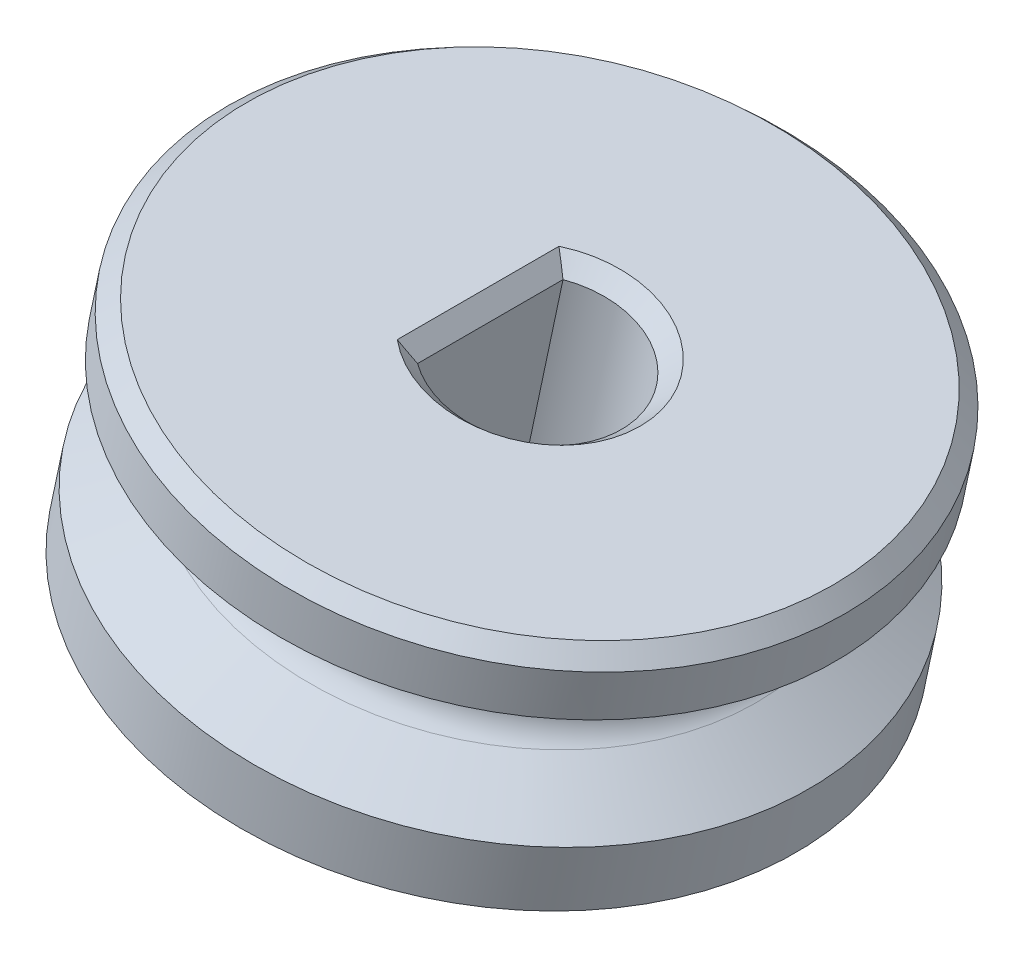
ISO-10303-21;
HEADER;
FILE_DESCRIPTION(('STEP AP214'),'2;1');
FILE_NAME('part.step','',(''),(''),'','','');
FILE_SCHEMA(('AUTOMOTIVE_DESIGN { 1 0 10303 214 1 1 1 1 }'));
ENDSEC;
DATA;
#1=APPLICATION_CONTEXT('core data for automotive mechanical design processes');
#2=APPLICATION_PROTOCOL_DEFINITION('international standard','automotive_design',2000,#1);
#3=PRODUCT_CONTEXT('',#1,'mechanical');
#4=PRODUCT('Part','Part','',(#3));
#5=PRODUCT_RELATED_PRODUCT_CATEGORY('part','',(#4));
#6=PRODUCT_DEFINITION_FORMATION('','',#4);
#7=PRODUCT_DEFINITION_CONTEXT('part definition',#1,'design');
#8=PRODUCT_DEFINITION('design','',#6,#7);
#9=PRODUCT_DEFINITION_SHAPE('','',#8);
#10=(LENGTH_UNIT() NAMED_UNIT(*) SI_UNIT(.MILLI.,.METRE.));
#11=(NAMED_UNIT(*) PLANE_ANGLE_UNIT() SI_UNIT($,.RADIAN.));
#12=(NAMED_UNIT(*) SI_UNIT($,.STERADIAN.) SOLID_ANGLE_UNIT());
#13=UNCERTAINTY_MEASURE_WITH_UNIT(LENGTH_MEASURE(1.E-05),#10,'distance_accuracy_value','');
#14=(GEOMETRIC_REPRESENTATION_CONTEXT(3) GLOBAL_UNCERTAINTY_ASSIGNED_CONTEXT((#13)) GLOBAL_UNIT_ASSIGNED_CONTEXT((#10,
#11,#12)) REPRESENTATION_CONTEXT('',''));
#15=CARTESIAN_POINT('',(0.,0.,0.));
#16=DIRECTION('',(0.,0.,1.));
#17=DIRECTION('',(1.,0.,0.));
#18=AXIS2_PLACEMENT_3D('',#15,#16,#17);
#19=CARTESIAN_POINT('',(-16.8643071290091,5.01311710508479,0.));
#20=DIRECTION('',(-0.207911690817802,-0.978147600733796,0.));
#21=DIRECTION('',(0.978147600733797,-0.207911690817802,0.));
#22=AXIS2_PLACEMENT_3D('',#19,#20,#21);
#23=PLANE('',#22);
#24=CARTESIAN_POINT('',(-16.8643071290091,5.01311710508479,0.));
#25=DIRECTION('',(-0.207911690817802,-0.978147600733796,0.));
#26=DIRECTION('',(0.978147600733797,-0.207911690817802,0.));
#27=AXIS2_PLACEMENT_3D('',#24,#25,#26);
#28=CIRCLE('',#27,3.8000000000001);
#29=CARTESIAN_POINT('',(-13.1473462462205,4.22305267997712,0.));
#30=VERTEX_POINT('',#29);
#31=EDGE_CURVE('E115',#30,#30,#28,.F.);
#32=ORIENTED_EDGE('',*,*,#31,.T.);
#33=EDGE_LOOP('',(#32));
#34=FACE_BOUND('',#33,.T.);
#35=CARTESIAN_POINT('',(-16.864307129009,5.01311710508477,0.));
#36=DIRECTION('',(-0.207911690817802,-0.978147600733796,0.));
#37=DIRECTION('',(0.978147600733797,-0.207911690817802,0.));
#38=AXIS2_PLACEMENT_3D('',#35,#36,#37);
#39=CIRCLE('',#38,1.30000000000077);
#40=CARTESIAN_POINT('',(-17.6468252095967,5.17944645773917,-1.02469507659637));
#41=VERTEX_POINT('',#40);
#42=CARTESIAN_POINT('',(-17.6468252095967,5.17944645773917,1.02469507659637));
#43=VERTEX_POINT('',#42);
#44=EDGE_CURVE('E101',#41,#43,#39,.T.);
#45=ORIENTED_EDGE('',*,*,#44,.T.);
#46=DIRECTION('',(0.,0.,-1.));
#47=VECTOR('',#46,1.);
#48=CARTESIAN_POINT('',(-17.6468252095967,5.17944645773917,0.));
#49=LINE('',#48,#47);
#50=EDGE_CURVE('E103',#43,#41,#49,.T.);
#51=ORIENTED_EDGE('',*,*,#50,.T.);
#52=EDGE_LOOP('',(#45,#51));
#53=FACE_BOUND('',#52,.T.);
#54=ADVANCED_FACE('F43',(#34,#53),#23,.F.);
#55=CARTESIAN_POINT('',(-17.9298780641152,2.25514051876985E-13,0.));
#56=DIRECTION('',(0.207911690817802,0.978147600733796,0.));
#57=DIRECTION('',(-0.978147600733797,0.207911690817802,0.));
#58=AXIS2_PLACEMENT_3D('',#55,#56,#57);
#59=CONICAL_SURFACE('',#58,0.,1.36135681655563);
#60=CARTESIAN_POINT('',(-17.8414920758528,0.415823381635657,0.));
#61=DIRECTION('',(0.207911690817802,0.978147600733796,0.));
#62=DIRECTION('',(-0.978147600733797,0.207911690817802,0.));
#63=AXIS2_PLACEMENT_3D('',#60,#61,#62);
#64=CIRCLE('',#63,2.00000000000008);
#65=CARTESIAN_POINT('',(-19.7977872773204,0.831646763271261,0.));
#66=VERTEX_POINT('',#65);
#67=EDGE_CURVE('E96',#66,#66,#64,.T.);
#68=ORIENTED_EDGE('',*,*,#67,.F.);
#69=EDGE_LOOP('',(#68));
#70=FACE_BOUND('',#69,.T.);
#71=CARTESIAN_POINT('',(-17.8812657705709,0.228702859899703,0.));
#72=DIRECTION('',(0.207911690817802,0.978147600733796,0.));
#73=DIRECTION('',(-0.978147600733797,0.207911690817802,0.));
#74=AXIS2_PLACEMENT_3D('',#71,#72,#73);
#75=CIRCLE('',#74,1.1);
#76=CARTESIAN_POINT('',(-18.4681543310109,0.353449874390292,-0.921954445729286));
#77=VERTEX_POINT('',#76);
#78=CARTESIAN_POINT('',(-18.4681543310109,0.353449874390293,0.921954445729286));
#79=VERTEX_POINT('',#78);
#80=EDGE_CURVE('E95',#77,#79,#75,.F.);
#81=ORIENTED_EDGE('',*,*,#80,.F.);
#82=CARTESIAN_POINT('',(-18.4681469227851,0.353484727352571,-0.922154445729286));
#83=CARTESIAN_POINT('',(-18.4698535218197,0.345455810149333,-0.87601502711287));
#84=CARTESIAN_POINT('',(-18.4715278506274,0.337578712427678,-0.829845905135946));
#85=CARTESIAN_POINT('',(-18.4747726223408,0.322313261726397,-0.737413271401055));
#86=CARTESIAN_POINT('',(-18.4763430424821,0.314925015845074,-0.691149741233467));
#87=CARTESIAN_POINT('',(-18.4793464695634,0.300795002366643,-0.598309478263664));
#88=CARTESIAN_POINT('',(-18.4807788409653,0.294056224741509,-0.551732263353229));
#89=CARTESIAN_POINT('',(-18.4834341720825,0.281563874016567,-0.458437256586886));
#90=CARTESIAN_POINT('',(-18.4846571314329,0.275810302634103,-0.411719464486078));
#91=CARTESIAN_POINT('',(-18.4867898869175,0.265776476965258,-0.318836683326539));
#92=CARTESIAN_POINT('',(-18.4877041826706,0.261475053636027,-0.27267415509489));
#93=CARTESIAN_POINT('',(-18.4891464042402,0.254689934615401,-0.180211057618883));
#94=CARTESIAN_POINT('',(-18.4896743931473,0.252205942105408,-0.133910512155927));
#95=CARTESIAN_POINT('',(-18.4902647441992,0.249428558771681,-0.0413347996844621));
#96=CARTESIAN_POINT('',(-18.490328087826,0.249130550437767,0.00494021423847374));
#97=CARTESIAN_POINT('',(-18.4899808761605,0.250764052893493,0.0974492092381901));
#98=CARTESIAN_POINT('',(-18.4895702922584,0.252695698281954,0.143683187669132));
#99=CARTESIAN_POINT('',(-18.4881403199663,0.25942318898297,0.250996866409799));
#100=CARTESIAN_POINT('',(-18.4869666446876,0.264944897038106,0.312027128923356));
#101=CARTESIAN_POINT('',(-18.4841247186317,0.278315107929355,0.433887781577674));
#102=CARTESIAN_POINT('',(-18.4824558026557,0.286166740280105,0.494717790914628));
#103=CARTESIAN_POINT('',(-18.4787911804139,0.303407432419138,0.616812318798005));
#104=CARTESIAN_POINT('',(-18.476792149678,0.312812132608721,0.678074465611502));
#105=CARTESIAN_POINT('',(-18.47259355874,0.332564949953103,0.800292231711232));
#106=CARTESIAN_POINT('',(-18.4703944837639,0.342910784298898,0.861248233265501));
#107=CARTESIAN_POINT('',(-18.4681469227851,0.353484727352571,0.922154445729286));
#108=B_SPLINE_CURVE_WITH_KNOTS('',3,(#82,#83,#84,#85,#86,#87,#88,#89,#90,#91,#92,#93,#94,#95,
#96,#97,#98,#99,#100,#101,#102,#103,#104,#105,#106,#107),.UNSPECIFIED.,.F.,.F.,(4,2,2,2,2,2,2,2,
2,2,2,2,4),(0.,0.140594462143718,0.281219624611676,0.422464018274744,0.563708658142811,
0.702795069869943,0.841858761252327,0.980628620031653,1.11940685645099,1.30320420875395,
1.48724956067832,1.67327614509564,1.85886296018762),.UNSPECIFIED.);
#109=EDGE_CURVE('E86',#77,#79,#108,.T.);
#110=ORIENTED_EDGE('',*,*,#109,.T.);
#111=EDGE_LOOP('',(#81,#110));
#112=FACE_BOUND('',#111,.T.);
#113=ADVANCED_FACE('F100',(#70,#112),#59,.T.);
#114=CARTESIAN_POINT('',(-16.8643071290091,5.0131171050847,0.));
#115=DIRECTION('',(0.207911690817802,0.978147600733796,0.));
#116=DIRECTION('',(-0.978147600733797,0.207911690817802,0.));
#117=AXIS2_PLACEMENT_3D('',#114,#115,#116);
#118=CYLINDRICAL_SURFACE('',#117,2.);
#119=CARTESIAN_POINT('',(-17.7375362304439,0.904897182002648,0.));
#120=DIRECTION('',(0.207911690817802,0.978147600733796,0.));
#121=DIRECTION('',(-0.978147600733797,0.207911690817802,0.));
#122=AXIS2_PLACEMENT_3D('',#119,#120,#121);
#123=CIRCLE('',#122,1.99999999999991);
#124=CARTESIAN_POINT('',(-19.6938314319115,1.32072056363825,0.));
#125=VERTEX_POINT('',#124);
#126=EDGE_CURVE('E294',#125,#125,#123,.T.);
#127=CARTESIAN_POINT('',(-19.6938314319115,1.32072056363825,0.));
#128=CARTESIAN_POINT('',(-19.6949143053011,1.31562604488443,0.));
#129=CARTESIAN_POINT('',(-19.6959971786908,1.31053152613061,0.));
#130=CARTESIAN_POINT('',(-19.6981629254702,1.30034248862296,0.));
#131=CARTESIAN_POINT('',(-19.6992457988598,1.29524796986914,0.));
#132=CARTESIAN_POINT('',(-19.7014115456392,1.28505893236149,0.));
#133=CARTESIAN_POINT('',(-19.7024944190289,1.27996441360767,0.));
#134=CARTESIAN_POINT('',(-19.7046601658082,1.26977537610002,0.));
#135=CARTESIAN_POINT('',(-19.7057430391979,1.2646808573462,0.));
#136=CARTESIAN_POINT('',(-19.7079087859772,1.25449181983856,0.));
#137=CARTESIAN_POINT('',(-19.7089916593669,1.24939730108473,0.));
#138=CARTESIAN_POINT('',(-19.7111574061463,1.23920826357709,0.));
#139=CARTESIAN_POINT('',(-19.712240279536,1.23411374482326,0.));
#140=CARTESIAN_POINT('',(-19.7144060263153,1.22392470731562,0.));
#141=CARTESIAN_POINT('',(-19.715488899705,1.2188301885618,0.));
#142=CARTESIAN_POINT('',(-19.7176546464843,1.20864115105415,0.));
#143=CARTESIAN_POINT('',(-19.718737519874,1.20354663230033,0.));
#144=CARTESIAN_POINT('',(-19.7209032666534,1.19335759479268,0.));
#145=CARTESIAN_POINT('',(-19.721986140043,1.18826307603886,0.));
#146=CARTESIAN_POINT('',(-19.7241518868224,1.17807403853121,0.));
#147=CARTESIAN_POINT('',(-19.7252347602121,1.17297951977739,0.));
#148=CARTESIAN_POINT('',(-19.7274005069914,1.16279048226974,0.));
#149=CARTESIAN_POINT('',(-19.7284833803811,1.15769596351592,0.));
#150=CARTESIAN_POINT('',(-19.7306491271604,1.14750692600828,0.));
#151=CARTESIAN_POINT('',(-19.7317320005501,1.14241240725445,0.));
#152=CARTESIAN_POINT('',(-19.7338977473295,1.13222336974681,0.));
#153=CARTESIAN_POINT('',(-19.7349806207192,1.12712885099299,0.));
#154=CARTESIAN_POINT('',(-19.7371463674985,1.11693981348534,0.));
#155=CARTESIAN_POINT('',(-19.7382292408882,1.11184529473152,0.));
#156=CARTESIAN_POINT('',(-19.7403949876675,1.10165625722387,0.));
#157=CARTESIAN_POINT('',(-19.7414778610572,1.09656173847005,0.));
#158=CARTESIAN_POINT('',(-19.7436436078366,1.0863727009624,0.));
#159=CARTESIAN_POINT('',(-19.7447264812262,1.08127818220858,0.));
#160=CARTESIAN_POINT('',(-19.7468922280056,1.07108914470093,0.));
#161=CARTESIAN_POINT('',(-19.7479751013953,1.06599462594711,0.));
#162=CARTESIAN_POINT('',(-19.7501408481746,1.05580558843947,0.));
#163=CARTESIAN_POINT('',(-19.7512237215643,1.05071106968564,0.));
#164=CARTESIAN_POINT('',(-19.7533894683436,1.040522032178,0.));
#165=CARTESIAN_POINT('',(-19.7544723417333,1.03542751342417,0.));
#166=CARTESIAN_POINT('',(-19.7566380885127,1.02523847591653,0.));
#167=CARTESIAN_POINT('',(-19.7577209619024,1.02014395716271,0.));
#168=CARTESIAN_POINT('',(-19.7598867086817,1.00995491965506,0.));
#169=CARTESIAN_POINT('',(-19.7609695820714,1.00486040090124,0.));
#170=CARTESIAN_POINT('',(-19.7631353288507,0.994671363393592,0.));
#171=CARTESIAN_POINT('',(-19.7642182022404,0.989576844639769,0.));
#172=CARTESIAN_POINT('',(-19.7663839490198,0.979387807132123,0.));
#173=CARTESIAN_POINT('',(-19.7674668224094,0.9742932883783,0.));
#174=CARTESIAN_POINT('',(-19.7696325691888,0.964104250870654,0.));
#175=CARTESIAN_POINT('',(-19.7707154425785,0.959009732116832,0.));
#176=CARTESIAN_POINT('',(-19.7728811893578,0.948820694609186,0.));
#177=CARTESIAN_POINT('',(-19.7739640627475,0.943726175855364,0.));
#178=CARTESIAN_POINT('',(-19.7761298095268,0.933537138347718,0.));
#179=CARTESIAN_POINT('',(-19.7772126829165,0.928442619593895,0.));
#180=CARTESIAN_POINT('',(-19.7793784296959,0.91825358208625,0.));
#181=CARTESIAN_POINT('',(-19.7804613030856,0.913159063332427,0.));
#182=CARTESIAN_POINT('',(-19.7826270498649,0.902970025824782,0.));
#183=CARTESIAN_POINT('',(-19.7837099232546,0.897875507070959,0.));
#184=CARTESIAN_POINT('',(-19.7858756700339,0.887686469563313,0.));
#185=CARTESIAN_POINT('',(-19.7869585434236,0.88259195080949,0.));
#186=CARTESIAN_POINT('',(-19.789124290203,0.872402913301844,0.));
#187=CARTESIAN_POINT('',(-19.7902071635926,0.867308394548022,0.));
#188=CARTESIAN_POINT('',(-19.792372910372,0.857119357040376,0.));
#189=CARTESIAN_POINT('',(-19.7934557837617,0.852024838286553,0.));
#190=CARTESIAN_POINT('',(-19.795621530541,0.841835800778908,0.));
#191=CARTESIAN_POINT('',(-19.7967044039307,0.836741282025085,0.));
#192=CARTESIAN_POINT('',(-19.7977872773204,0.831646763271261,0.));
#193=B_SPLINE_CURVE_WITH_KNOTS('',3,(#127,#128,#129,#130,#131,#132,#133,#134,#135,#136,#137,
#138,#139,#140,#141,#142,#143,#144,#145,#146,#147,#148,#149,#150,#151,#152,#153,#154,#155,#156,
#157,#158,#159,#160,#161,#162,#163,#164,#165,#166,#167,#168,#169,#170,#171,#172,#173,#174,#175,
#176,#177,#178,#179,#180,#181,#182,#183,#184,#185,#186,#187,#188,#189,#190,#191,#192),
.UNSPECIFIED.,.F.,.F.,(4,2,2,2,2,2,2,2,2,2,2,2,2,2,2,2,2,2,2,2,2,2,2,2,2,2,2,2,2,2,2,2,4),(0.,
0.0156250000000039,0.031250000000007,0.0468750000000093,0.0625000000000124,0.0781250000000147,
0.0937500000000186,0.109375000000022,0.125000000000024,0.140625000000026,0.15625000000003,
0.171875000000033,0.187500000000036,0.203125000000039,0.218750000000042,0.234375000000045,
0.250000000000048,0.26562500000005,0.281250000000053,0.296875000000057,0.31250000000006,
0.328125000000063,0.343750000000065,0.359375000000069,0.375000000000071,0.390625000000074,
0.406250000000077,0.42187500000008,0.437500000000083,0.453125000000086,0.468750000000088,
0.484375000000092,0.500000000000095),.UNSPECIFIED.);
#194=EDGE_CURVE('BSEAM145',#125,#66,#193,.T.);
#195=ORIENTED_EDGE('',*,*,#126,.F.);
#196=ORIENTED_EDGE('',*,*,#67,.T.);
#197=ORIENTED_EDGE('',*,*,#194,.T.);
#198=ORIENTED_EDGE('',*,*,#194,.F.);
#199=EDGE_LOOP('',(#195,#197,#196,#198));
#200=FACE_BOUND('',#199,.T.);
#201=ADVANCED_FACE('F145',(#200),#118,.T.);
#202=CARTESIAN_POINT('',(-17.7375362304438,0.904897182002761,0.));
#203=DIRECTION('',(0.207911690817802,0.978147600733796,0.));
#204=DIRECTION('',(-0.978147600733797,0.207911690817802,0.));
#205=AXIS2_PLACEMENT_3D('',#202,#203,#204);
#206=TOROIDAL_SURFACE('',#205,3.00000000000002,1.00000000000011);
#207=CARTESIAN_POINT('',(-17.529624539626,1.88304478273667,0.));
#208=DIRECTION('',(0.207911690817802,0.978147600733796,0.));
#209=DIRECTION('',(-0.978147600733797,0.207911690817802,0.));
#210=AXIS2_PLACEMENT_3D('',#207,#208,#209);
#211=CIRCLE('',#210,2.99999999999997);
#212=CARTESIAN_POINT('',(-20.4640673418274,2.50677985519007,0.));
#213=VERTEX_POINT('',#212);
#214=EDGE_CURVE('E291',#213,#213,#211,.T.);
#215=ORIENTED_EDGE('',*,*,#214,.F.);
#216=EDGE_LOOP('',(#215));
#217=FACE_BOUND('',#216,.T.);
#218=ORIENTED_EDGE('',*,*,#126,.T.);
#219=EDGE_LOOP('',(#218));
#220=FACE_BOUND('',#219,.T.);
#221=ADVANCED_FACE('F149',(#217,#220),#206,.F.);
#222=CARTESIAN_POINT('',(-14.5951817374246,1.25930971028327,0.));
#223=DIRECTION('',(0.207911690817802,0.978147600733796,0.));
#224=DIRECTION('',(-0.978147600733797,0.207911690817802,0.));
#225=AXIS2_PLACEMENT_3D('',#222,#223,#224);
#226=PLANE('',#225);
#227=CARTESIAN_POINT('',(-17.529624539626,1.88304478273669,0.));
#228=DIRECTION('',(0.207911690817802,0.978147600733796,0.));
#229=DIRECTION('',(-0.978147600733797,0.207911690817802,0.));
#230=AXIS2_PLACEMENT_3D('',#227,#228,#229);
#231=CIRCLE('',#230,4.00000000000015);
#232=CARTESIAN_POINT('',(-21.4422149425613,2.71469154600792,0.));
#233=VERTEX_POINT('',#232);
#234=EDGE_CURVE('E288',#233,#233,#231,.T.);
#235=ORIENTED_EDGE('',*,*,#234,.F.);
#236=EDGE_LOOP('',(#235));
#237=FACE_BOUND('',#236,.T.);
#238=ORIENTED_EDGE('',*,*,#214,.T.);
#239=EDGE_LOOP('',(#238));
#240=FACE_BOUND('',#239,.T.);
#241=ADVANCED_FACE('F153',(#237,#240),#226,.F.);
#242=CARTESIAN_POINT('',(-16.8643071290091,5.0131171050847,0.));
#243=DIRECTION('',(0.207911690817802,0.978147600733796,0.));
#244=DIRECTION('',(-0.978147600733797,0.207911690817802,0.));
#245=AXIS2_PLACEMENT_3D('',#242,#243,#244);
#246=CYLINDRICAL_SURFACE('',#245,4.00000000000013);
#247=CARTESIAN_POINT('',(-17.3632951869718,2.66556286332372,0.));
#248=DIRECTION('',(0.207911690817802,0.978147600733796,0.));
#249=DIRECTION('',(-0.978147600733797,0.207911690817802,0.));
#250=AXIS2_PLACEMENT_3D('',#247,#248,#249);
#251=CIRCLE('',#250,4.00000000000011);
#252=CARTESIAN_POINT('',(-21.2758855899071,3.49720962659496,0.));
#253=VERTEX_POINT('',#252);
#254=EDGE_CURVE('E285',#253,#253,#251,.T.);
#255=CARTESIAN_POINT('',(-21.2758855899071,3.49720962659496,0.));
#256=CARTESIAN_POINT('',(-21.2776181873306,3.48905839658885,0.));
#257=CARTESIAN_POINT('',(-21.279350784754,3.48090716658273,0.));
#258=CARTESIAN_POINT('',(-21.282815979601,3.4646047065705,0.));
#259=CARTESIAN_POINT('',(-21.2845485770245,3.45645347656439,0.));
#260=CARTESIAN_POINT('',(-21.2880137718715,3.44015101655216,0.));
#261=CARTESIAN_POINT('',(-21.2897463692949,3.43199978654604,0.));
#262=CARTESIAN_POINT('',(-21.2932115641419,3.41569732653381,0.));
#263=CARTESIAN_POINT('',(-21.2949441615654,3.4075460965277,0.));
#264=CARTESIAN_POINT('',(-21.2984093564123,3.39124363651547,0.));
#265=CARTESIAN_POINT('',(-21.3001419538358,3.38309240650935,0.));
#266=CARTESIAN_POINT('',(-21.3036071486828,3.36678994649712,0.));
#267=CARTESIAN_POINT('',(-21.3053397461063,3.35863871649101,0.));
#268=CARTESIAN_POINT('',(-21.3088049409532,3.34233625647878,0.));
#269=CARTESIAN_POINT('',(-21.3105375383767,3.33418502647266,0.));
#270=CARTESIAN_POINT('',(-21.3140027332237,3.31788256646043,0.));
#271=CARTESIAN_POINT('',(-21.3157353306472,3.30973133645432,0.));
#272=CARTESIAN_POINT('',(-21.3192005254941,3.29342887644209,0.));
#273=CARTESIAN_POINT('',(-21.3209331229176,3.28527764643597,0.));
#274=CARTESIAN_POINT('',(-21.3243983177646,3.26897518642374,0.));
#275=CARTESIAN_POINT('',(-21.3261309151881,3.26082395641763,0.));
#276=CARTESIAN_POINT('',(-21.329596110035,3.2445214964054,0.));
#277=CARTESIAN_POINT('',(-21.3313287074585,3.23637026639928,0.));
#278=CARTESIAN_POINT('',(-21.3347939023055,3.22006780638705,0.));
#279=CARTESIAN_POINT('',(-21.3365264997289,3.21191657638094,0.));
#280=CARTESIAN_POINT('',(-21.3399916945759,3.19561411636871,0.));
#281=CARTESIAN_POINT('',(-21.3417242919994,3.18746288636259,0.));
#282=CARTESIAN_POINT('',(-21.3451894868464,3.17116042635036,0.));
#283=CARTESIAN_POINT('',(-21.3469220842698,3.16300919634425,0.));
#284=CARTESIAN_POINT('',(-21.3503872791168,3.14670673633202,0.));
#285=CARTESIAN_POINT('',(-21.3521198765403,3.1385555063259,0.));
#286=CARTESIAN_POINT('',(-21.3555850713872,3.12225304631367,0.));
#287=CARTESIAN_POINT('',(-21.3573176688107,3.11410181630756,0.));
#288=CARTESIAN_POINT('',(-21.3607828636577,3.09779935629533,0.));
#289=CARTESIAN_POINT('',(-21.3625154610812,3.08964812628921,0.));
#290=CARTESIAN_POINT('',(-21.3659806559281,3.07334566627698,0.));
#291=CARTESIAN_POINT('',(-21.3677132533516,3.06519443627087,0.));
#292=CARTESIAN_POINT('',(-21.3711784481986,3.04889197625864,0.));
#293=CARTESIAN_POINT('',(-21.3729110456221,3.04074074625252,0.));
#294=CARTESIAN_POINT('',(-21.376376240469,3.02443828624029,0.));
#295=CARTESIAN_POINT('',(-21.3781088378925,3.01628705623418,0.));
#296=CARTESIAN_POINT('',(-21.3815740327395,2.99998459622195,0.));
#297=CARTESIAN_POINT('',(-21.3833066301629,2.99183336621583,0.));
#298=CARTESIAN_POINT('',(-21.3867718250099,2.9755309062036,0.));
#299=CARTESIAN_POINT('',(-21.3885044224334,2.96737967619749,0.));
#300=CARTESIAN_POINT('',(-21.3919696172804,2.95107721618526,0.));
#301=CARTESIAN_POINT('',(-21.3937022147038,2.94292598617914,0.));
#302=CARTESIAN_POINT('',(-21.3971674095508,2.92662352616691,0.));
#303=CARTESIAN_POINT('',(-21.3989000069743,2.9184722961608,0.));
#304=CARTESIAN_POINT('',(-21.4023652018212,2.90216983614857,0.));
#305=CARTESIAN_POINT('',(-21.4040977992447,2.89401860614245,0.));
#306=CARTESIAN_POINT('',(-21.4075629940917,2.87771614613022,0.));
#307=CARTESIAN_POINT('',(-21.4092955915152,2.86956491612411,0.));
#308=CARTESIAN_POINT('',(-21.4127607863621,2.85326245611188,0.));
#309=CARTESIAN_POINT('',(-21.4144933837856,2.84511122610576,0.));
#310=CARTESIAN_POINT('',(-21.4179585786326,2.82880876609353,0.));
#311=CARTESIAN_POINT('',(-21.4196911760561,2.82065753608742,0.));
#312=CARTESIAN_POINT('',(-21.423156370903,2.80435507607519,0.));
#313=CARTESIAN_POINT('',(-21.4248889683265,2.79620384606907,0.));
#314=CARTESIAN_POINT('',(-21.4283541631735,2.77990138605684,0.));
#315=CARTESIAN_POINT('',(-21.430086760597,2.77175015605073,0.));
#316=CARTESIAN_POINT('',(-21.4335519554439,2.7554476960385,0.));
#317=CARTESIAN_POINT('',(-21.4352845528674,2.74729646603238,0.));
#318=CARTESIAN_POINT('',(-21.4387497477144,2.73099400602015,0.));
#319=CARTESIAN_POINT('',(-21.4404823451378,2.72284277601404,0.));
#320=CARTESIAN_POINT('',(-21.4422149425613,2.71469154600792,0.));
#321=B_SPLINE_CURVE_WITH_KNOTS('',3,(#255,#256,#257,#258,#259,#260,#261,#262,#263,#264,#265,
#266,#267,#268,#269,#270,#271,#272,#273,#274,#275,#276,#277,#278,#279,#280,#281,#282,#283,#284,
#285,#286,#287,#288,#289,#290,#291,#292,#293,#294,#295,#296,#297,#298,#299,#300,#301,#302,#303,
#304,#305,#306,#307,#308,#309,#310,#311,#312,#313,#314,#315,#316,#317,#318,#319,#320),
.UNSPECIFIED.,.F.,.F.,(4,2,2,2,2,2,2,2,2,2,2,2,2,2,2,2,2,2,2,2,2,2,2,2,2,2,2,2,2,2,2,2,4),(0.,
0.025,0.0500000000000004,0.0750000000000004,0.0999999999999997,0.125,0.15,0.175,0.2,0.225,0.25,
0.275,0.3,0.325000000000001,0.350000000000001,0.375000000000001,0.400000000000001,
0.425000000000001,0.450000000000001,0.475000000000001,0.500000000000001,0.525000000000001,
0.550000000000001,0.575000000000001,0.600000000000001,0.625000000000001,0.650000000000001,
0.675000000000001,0.700000000000001,0.725000000000001,0.750000000000001,0.775000000000001,
0.800000000000001),.UNSPECIFIED.);
#322=EDGE_CURVE('BSEAM157',#253,#233,#321,.T.);
#323=ORIENTED_EDGE('',*,*,#254,.F.);
#324=ORIENTED_EDGE('',*,*,#234,.T.);
#325=ORIENTED_EDGE('',*,*,#322,.T.);
#326=ORIENTED_EDGE('',*,*,#322,.F.);
#327=EDGE_LOOP('',(#323,#325,#324,#326));
#328=FACE_BOUND('',#327,.T.);
#329=ADVANCED_FACE('F157',(#328),#246,.T.);
#330=CARTESIAN_POINT('',(-17.3632951869718,2.66556286332372,0.));
#331=DIRECTION('',(-0.207911690817802,-0.978147600733796,0.));
#332=DIRECTION('',(0.978147600733797,-0.207911690817802,0.));
#333=AXIS2_PLACEMENT_3D('',#330,#331,#332);
#334=CONICAL_SURFACE('',#333,4.00000000000011,1.0471975511966);
#335=CARTESIAN_POINT('',(-17.2689885567143,3.10924067555626,0.));
#336=DIRECTION('',(0.207911690817802,0.978147600733796,0.));
#337=DIRECTION('',(-0.978147600733797,0.207911690817802,0.));
#338=AXIS2_PLACEMENT_3D('',#335,#336,#337);
#339=CIRCLE('',#338,3.21435935394499);
#340=CARTESIAN_POINT('',(-20.4131064466719,3.77754356373098,0.));
#341=VERTEX_POINT('',#340);
#342=EDGE_CURVE('E282',#341,#341,#339,.T.);
#343=ORIENTED_EDGE('',*,*,#342,.F.);
#344=EDGE_LOOP('',(#343));
#345=FACE_BOUND('',#344,.T.);
#346=ORIENTED_EDGE('',*,*,#254,.T.);
#347=EDGE_LOOP('',(#346));
#348=FACE_BOUND('',#347,.T.);
#349=ADVANCED_FACE('F161',(#345,#348),#334,.T.);
#350=CARTESIAN_POINT('',(-17.1969658343175,3.44808094391077,0.));
#351=DIRECTION('',(0.207911690817802,0.978147600733796,0.));
#352=DIRECTION('',(-0.978147600733797,0.207911690817802,0.));
#353=AXIS2_PLACEMENT_3D('',#350,#351,#352);
#354=TOROIDAL_SURFACE('',#353,3.41435935394498,0.4);
#355=CARTESIAN_POINT('',(-17.1249431119207,3.78692121226527,0.));
#356=DIRECTION('',(0.207911690817802,0.978147600733796,0.));
#357=DIRECTION('',(-0.978147600733797,0.207911690817802,0.));
#358=AXIS2_PLACEMENT_3D('',#355,#356,#357);
#359=CIRCLE('',#358,3.21435935394496);
#360=CARTESIAN_POINT('',(-20.2690610018782,4.45522410043999,0.));
#361=VERTEX_POINT('',#360);
#362=EDGE_CURVE('E277',#361,#361,#359,.T.);
#363=ORIENTED_EDGE('',*,*,#362,.F.);
#364=EDGE_LOOP('',(#363));
#365=FACE_BOUND('',#364,.T.);
#366=ORIENTED_EDGE('',*,*,#342,.T.);
#367=EDGE_LOOP('',(#366));
#368=FACE_BOUND('',#367,.T.);
#369=ADVANCED_FACE('F165',(#365,#368),#354,.F.);
#370=CARTESIAN_POINT('',(-17.1249431119207,3.78692121226527,0.));
#371=DIRECTION('',(0.207911690817802,0.978147600733796,0.));
#372=DIRECTION('',(-0.978147600733797,0.207911690817802,0.));
#373=AXIS2_PLACEMENT_3D('',#370,#371,#372);
#374=CONICAL_SURFACE('',#373,3.21435935394496,1.04719755119655);
#375=CARTESIAN_POINT('',(-17.0306364816633,4.23059902449784,0.));
#376=DIRECTION('',(0.207911690817802,0.978147600733796,0.));
#377=DIRECTION('',(-0.978147600733797,0.207911690817802,0.));
#378=AXIS2_PLACEMENT_3D('',#375,#376,#377);
#379=CIRCLE('',#378,4.00000000000004);
#380=CARTESIAN_POINT('',(-20.9432268845985,5.06224578776905,0.));
#381=VERTEX_POINT('',#380);
#382=EDGE_CURVE('E274',#381,#381,#379,.T.);
#383=CARTESIAN_POINT('',(-20.9432268845985,5.06224578776905,0.));
#384=CARTESIAN_POINT('',(-20.9362043233202,5.05592264519271,0.));
#385=CARTESIAN_POINT('',(-20.9291817620418,5.04959950261636,0.));
#386=CARTESIAN_POINT('',(-20.9151366394852,5.03695321746368,0.));
#387=CARTESIAN_POINT('',(-20.9081140782068,5.03063007488733,0.));
#388=CARTESIAN_POINT('',(-20.8940689556501,5.01798378973464,0.));
#389=CARTESIAN_POINT('',(-20.8870463943718,5.0116606471583,0.));
#390=CARTESIAN_POINT('',(-20.8730012718151,4.99901436200561,0.));
#391=CARTESIAN_POINT('',(-20.8659787105368,4.99269121942927,0.));
#392=CARTESIAN_POINT('',(-20.8519335879801,4.98004493427658,0.));
#393=CARTESIAN_POINT('',(-20.8449110267018,4.97372179170023,0.));
#394=CARTESIAN_POINT('',(-20.8308659041451,4.96107550654754,0.));
#395=CARTESIAN_POINT('',(-20.8238433428668,4.9547523639712,0.));
#396=CARTESIAN_POINT('',(-20.8097982203101,4.94210607881851,0.));
#397=CARTESIAN_POINT('',(-20.8027756590318,4.93578293624217,0.));
#398=CARTESIAN_POINT('',(-20.7887305364751,4.92313665108948,0.));
#399=CARTESIAN_POINT('',(-20.7817079751968,4.91681350851313,0.));
#400=CARTESIAN_POINT('',(-20.7676628526401,4.90416722336044,0.));
#401=CARTESIAN_POINT('',(-20.7606402913618,4.8978440807841,0.));
#402=CARTESIAN_POINT('',(-20.7465951688051,4.88519779563141,0.));
#403=CARTESIAN_POINT('',(-20.7395726075268,4.87887465305507,0.));
#404=CARTESIAN_POINT('',(-20.7255274849701,4.86622836790238,0.));
#405=CARTESIAN_POINT('',(-20.7185049236917,4.85990522532603,0.));
#406=CARTESIAN_POINT('',(-20.7044598011351,4.84725894017334,0.));
#407=CARTESIAN_POINT('',(-20.6974372398567,4.840935797597,0.));
#408=CARTESIAN_POINT('',(-20.6833921173001,4.82828951244431,0.));
#409=CARTESIAN_POINT('',(-20.6763695560217,4.82196636986796,0.));
#410=CARTESIAN_POINT('',(-20.6623244334651,4.80932008471528,0.));
#411=CARTESIAN_POINT('',(-20.6553018721867,4.80299694213893,0.));
#412=CARTESIAN_POINT('',(-20.64125674963,4.79035065698624,0.));
#413=CARTESIAN_POINT('',(-20.6342341883517,4.7840275144099,0.));
#414=CARTESIAN_POINT('',(-20.620189065795,4.77138122925721,0.));
#415=CARTESIAN_POINT('',(-20.6131665045167,4.76505808668086,0.));
#416=CARTESIAN_POINT('',(-20.59912138196,4.75241180152818,0.));
#417=CARTESIAN_POINT('',(-20.5920988206817,4.74608865895183,0.));
#418=CARTESIAN_POINT('',(-20.578053698125,4.73344237379914,0.));
#419=CARTESIAN_POINT('',(-20.5710311368467,4.7271192312228,0.));
#420=CARTESIAN_POINT('',(-20.55698601429,4.71447294607011,0.));
#421=CARTESIAN_POINT('',(-20.5499634530117,4.70814980349376,0.));
#422=CARTESIAN_POINT('',(-20.535918330455,4.69550351834108,0.));
#423=CARTESIAN_POINT('',(-20.5288957691767,4.68918037576473,0.));
#424=CARTESIAN_POINT('',(-20.51485064662,4.67653409061204,0.));
#425=CARTESIAN_POINT('',(-20.5078280853417,4.6702109480357,0.));
#426=CARTESIAN_POINT('',(-20.493782962785,4.65756466288301,0.));
#427=CARTESIAN_POINT('',(-20.4867604015067,4.65124152030666,0.));
#428=CARTESIAN_POINT('',(-20.47271527895,4.63859523515398,0.));
#429=CARTESIAN_POINT('',(-20.4656927176716,4.63227209257763,0.));
#430=CARTESIAN_POINT('',(-20.451647595115,4.61962580742494,0.));
#431=CARTESIAN_POINT('',(-20.4446250338366,4.6133026648486,0.));
#432=CARTESIAN_POINT('',(-20.43057991128,4.60065637969591,0.));
#433=CARTESIAN_POINT('',(-20.4235573500016,4.59433323711957,0.));
#434=CARTESIAN_POINT('',(-20.409512227445,4.58168695196688,0.));
#435=CARTESIAN_POINT('',(-20.4024896661666,4.57536380939053,0.));
#436=CARTESIAN_POINT('',(-20.3884445436099,4.56271752423784,0.));
#437=CARTESIAN_POINT('',(-20.3814219823316,4.5563943816615,0.));
#438=CARTESIAN_POINT('',(-20.3673768597749,4.54374809650881,0.));
#439=CARTESIAN_POINT('',(-20.3603542984966,4.53742495393246,0.));
#440=CARTESIAN_POINT('',(-20.3463091759399,4.52477866877978,0.));
#441=CARTESIAN_POINT('',(-20.3392866146616,4.51845552620343,0.));
#442=CARTESIAN_POINT('',(-20.3252414921049,4.50580924105074,0.));
#443=CARTESIAN_POINT('',(-20.3182189308266,4.4994860984744,0.));
#444=CARTESIAN_POINT('',(-20.3041738082699,4.48683981332171,0.));
#445=CARTESIAN_POINT('',(-20.2971512469916,4.48051667074536,0.));
#446=CARTESIAN_POINT('',(-20.2831061244349,4.46787038559268,0.));
#447=CARTESIAN_POINT('',(-20.2760835631566,4.46154724301633,0.));
#448=CARTESIAN_POINT('',(-20.2690610018782,4.45522410043999,0.));
#449=B_SPLINE_CURVE_WITH_KNOTS('',3,(#383,#384,#385,#386,#387,#388,#389,#390,#391,#392,#393,
#394,#395,#396,#397,#398,#399,#400,#401,#402,#403,#404,#405,#406,#407,#408,#409,#410,#411,#412,
#413,#414,#415,#416,#417,#418,#419,#420,#421,#422,#423,#424,#425,#426,#427,#428,#429,#430,#431,
#432,#433,#434,#435,#436,#437,#438,#439,#440,#441,#442,#443,#444,#445,#446,#447,#448),
.UNSPECIFIED.,.F.,.F.,(4,2,2,2,2,2,2,2,2,2,2,2,2,2,2,2,2,2,2,2,2,2,2,2,2,2,2,2,2,2,2,2,4),(0.,
0.0283493649053894,0.0566987298107782,0.0850480947161675,0.113397459621557,0.141746824526944,
0.170096189432333,0.19844555433772,0.22679491924311,0.255144284148499,0.283493649053888,
0.311843013959277,0.340192378864667,0.368541743770054,0.396891108675444,0.425240473580833,
0.453589838486222,0.481939203391611,0.510288568297,0.53863793320239,0.56698729810778,
0.595336663013167,0.623686027918555,0.652035392823945,0.680384757729331,0.708734122634721,
0.737083487540111,0.7654328524455,0.793782217350889,0.822131582256276,0.850480947161665,
0.878830312067054,0.907179676972444),.UNSPECIFIED.);
#450=EDGE_CURVE('BSEAM169',#381,#361,#449,.T.);
#451=ORIENTED_EDGE('',*,*,#382,.F.);
#452=ORIENTED_EDGE('',*,*,#362,.T.);
#453=ORIENTED_EDGE('',*,*,#450,.T.);
#454=ORIENTED_EDGE('',*,*,#450,.F.);
#455=EDGE_LOOP('',(#451,#453,#452,#454));
#456=FACE_BOUND('',#455,.T.);
#457=ADVANCED_FACE('F169',(#456),#374,.T.);
#458=CARTESIAN_POINT('',(-16.8643071290091,5.0131171050847,0.));
#459=DIRECTION('',(0.207911690817802,0.978147600733796,0.));
#460=DIRECTION('',(-0.978147600733797,0.207911690817802,0.));
#461=AXIS2_PLACEMENT_3D('',#458,#459,#460);
#462=CYLINDRICAL_SURFACE('',#461,4.00000000000002);
#463=CARTESIAN_POINT('',(-16.9058894671726,4.81748758493811,0.));
#464=DIRECTION('',(-0.207911690817803,-0.978147600733796,0.));
#465=DIRECTION('',(0.978147600733797,-0.207911690817803,0.));
#466=AXIS2_PLACEMENT_3D('',#463,#464,#465);
#467=CIRCLE('',#466,4.00000000000002);
#468=CARTESIAN_POINT('',(-20.8184798701078,5.64913434820932,0.));
#469=VERTEX_POINT('',#468);
#470=EDGE_CURVE('E118',#469,#469,#467,.T.);
#471=CARTESIAN_POINT('',(-20.8184798701078,5.64913434820932,0.));
#472=CARTESIAN_POINT('',(-20.8197793181754,5.64302092570473,0.));
#473=CARTESIAN_POINT('',(-20.821078766243,5.63690750320015,0.));
#474=CARTESIAN_POINT('',(-20.8236776623782,5.62468065819098,0.));
#475=CARTESIAN_POINT('',(-20.8249771104459,5.61856723568639,0.));
#476=CARTESIAN_POINT('',(-20.8275760065811,5.60634039067722,0.));
#477=CARTESIAN_POINT('',(-20.8288754546487,5.60022696817263,0.));
#478=CARTESIAN_POINT('',(-20.8314743507839,5.58800012316346,0.));
#479=CARTESIAN_POINT('',(-20.8327737988515,5.58188670065887,0.));
#480=CARTESIAN_POINT('',(-20.8353726949867,5.5696598556497,0.));
#481=CARTESIAN_POINT('',(-20.8366721430544,5.56354643314511,0.));
#482=CARTESIAN_POINT('',(-20.8392710391896,5.55131958813594,0.));
#483=CARTESIAN_POINT('',(-20.8405704872572,5.54520616563136,0.));
#484=CARTESIAN_POINT('',(-20.8431693833924,5.53297932062218,0.));
#485=CARTESIAN_POINT('',(-20.84446883146,5.5268658981176,0.));
#486=CARTESIAN_POINT('',(-20.8470677275953,5.51463905310843,0.));
#487=CARTESIAN_POINT('',(-20.8483671756629,5.50852563060384,0.));
#488=CARTESIAN_POINT('',(-20.8509660717981,5.49629878559467,0.));
#489=CARTESIAN_POINT('',(-20.8522655198657,5.49018536309008,0.));
#490=CARTESIAN_POINT('',(-20.8548644160009,5.47795851808091,0.));
#491=CARTESIAN_POINT('',(-20.8561638640685,5.47184509557632,0.));
#492=CARTESIAN_POINT('',(-20.8587627602038,5.45961825056715,0.));
#493=CARTESIAN_POINT('',(-20.8600622082714,5.45350482806256,0.));
#494=CARTESIAN_POINT('',(-20.8626611044066,5.44127798305339,0.));
#495=CARTESIAN_POINT('',(-20.8639605524742,5.43516456054881,0.));
#496=CARTESIAN_POINT('',(-20.8665594486094,5.42293771553963,0.));
#497=CARTESIAN_POINT('',(-20.867858896677,5.41682429303505,0.));
#498=CARTESIAN_POINT('',(-20.8704577928123,5.40459744802587,0.));
#499=CARTESIAN_POINT('',(-20.8717572408799,5.39848402552129,0.));
#500=CARTESIAN_POINT('',(-20.8743561370151,5.38625718051212,0.));
#501=CARTESIAN_POINT('',(-20.8756555850827,5.38014375800753,0.));
#502=CARTESIAN_POINT('',(-20.8782544812179,5.36791691299836,0.));
#503=CARTESIAN_POINT('',(-20.8795539292855,5.36180349049377,0.));
#504=CARTESIAN_POINT('',(-20.8821528254208,5.3495766454846,0.));
#505=CARTESIAN_POINT('',(-20.8834522734884,5.34346322298001,0.));
#506=CARTESIAN_POINT('',(-20.8860511696236,5.33123637797084,0.));
#507=CARTESIAN_POINT('',(-20.8873506176912,5.32512295546626,0.));
#508=CARTESIAN_POINT('',(-20.8899495138264,5.31289611045708,0.));
#509=CARTESIAN_POINT('',(-20.891248961894,5.3067826879525,0.));
#510=CARTESIAN_POINT('',(-20.8938478580293,5.29455584294332,0.));
#511=CARTESIAN_POINT('',(-20.8951473060969,5.28844242043874,0.));
#512=CARTESIAN_POINT('',(-20.8977462022321,5.27621557542957,0.));
#513=CARTESIAN_POINT('',(-20.8990456502997,5.27010215292498,0.));
#514=CARTESIAN_POINT('',(-20.9016445464349,5.25787530791581,0.));
#515=CARTESIAN_POINT('',(-20.9029439945025,5.25176188541122,0.));
#516=CARTESIAN_POINT('',(-20.9055428906378,5.23953504040205,0.));
#517=CARTESIAN_POINT('',(-20.9068423387054,5.23342161789746,0.));
#518=CARTESIAN_POINT('',(-20.9094412348406,5.22119477288829,0.));
#519=CARTESIAN_POINT('',(-20.9107406829082,5.2150813503837,0.));
#520=CARTESIAN_POINT('',(-20.9133395790434,5.20285450537453,0.));
#521=CARTESIAN_POINT('',(-20.914639027111,5.19674108286995,0.));
#522=CARTESIAN_POINT('',(-20.9172379232463,5.18451423786077,0.));
#523=CARTESIAN_POINT('',(-20.9185373713139,5.17840081535619,0.));
#524=CARTESIAN_POINT('',(-20.9211362674491,5.16617397034701,0.));
#525=CARTESIAN_POINT('',(-20.9224357155167,5.16006054784243,0.));
#526=CARTESIAN_POINT('',(-20.9250346116519,5.14783370283326,0.));
#527=CARTESIAN_POINT('',(-20.9263340597195,5.14172028032867,0.));
#528=CARTESIAN_POINT('',(-20.9289329558548,5.1294934353195,0.));
#529=CARTESIAN_POINT('',(-20.9302324039224,5.12338001281491,0.));
#530=CARTESIAN_POINT('',(-20.9328313000576,5.11115316780574,0.));
#531=CARTESIAN_POINT('',(-20.9341307481252,5.10503974530115,0.));
#532=CARTESIAN_POINT('',(-20.9367296442604,5.09281290029198,0.));
#533=CARTESIAN_POINT('',(-20.938029092328,5.0866994777874,0.));
#534=CARTESIAN_POINT('',(-20.9406279884633,5.07447263277822,0.));
#535=CARTESIAN_POINT('',(-20.9419274365309,5.06835921027364,0.));
#536=CARTESIAN_POINT('',(-20.9432268845985,5.06224578776905,0.));
#537=B_SPLINE_CURVE_WITH_KNOTS('',3,(#471,#472,#473,#474,#475,#476,#477,#478,#479,#480,#481,
#482,#483,#484,#485,#486,#487,#488,#489,#490,#491,#492,#493,#494,#495,#496,#497,#498,#499,#500,
#501,#502,#503,#504,#505,#506,#507,#508,#509,#510,#511,#512,#513,#514,#515,#516,#517,#518,#519,
#520,#521,#522,#523,#524,#525,#526,#527,#528,#529,#530,#531,#532,#533,#534,#535,#536),
.UNSPECIFIED.,.F.,.F.,(4,2,2,2,2,2,2,2,2,2,2,2,2,2,2,2,2,2,2,2,2,2,2,2,2,2,2,2,2,2,2,2,4),(0.,
0.0187500000000005,0.0375000000000001,0.0562499999999999,0.0749999999999995,0.09375,
0.112499999999999,0.131249999999999,0.149999999999998,0.168749999999998,0.187499999999998,
0.206249999999997,0.224999999999998,0.243749999999997,0.262499999999997,0.281249999999997,
0.299999999999997,0.318749999999996,0.337499999999996,0.356249999999996,0.374999999999995,
0.393749999999995,0.412499999999995,0.431249999999995,0.449999999999994,0.468749999999995,
0.487499999999994,0.506249999999993,0.524999999999994,0.543749999999993,0.562499999999993,
0.581249999999992,0.599999999999992),.UNSPECIFIED.);
#538=EDGE_CURVE('BSEAM173',#469,#381,#537,.T.);
#539=ORIENTED_EDGE('',*,*,#470,.T.);
#540=ORIENTED_EDGE('',*,*,#382,.T.);
#541=ORIENTED_EDGE('',*,*,#538,.T.);
#542=ORIENTED_EDGE('',*,*,#538,.F.);
#543=EDGE_LOOP('',(#539,#541,#540,#542));
#544=FACE_BOUND('',#543,.T.);
#545=ADVANCED_FACE('F173',(#544),#462,.T.);
#546=CARTESIAN_POINT('',(-18.0817068028305,-0.714298055645266,0.));
#547=DIRECTION('',(0.207911690817757,0.978147600733806,0.));
#548=DIRECTION('',(-0.978147600733806,0.207911690817757,0.));
#549=AXIS2_PLACEMENT_3D('',#546,#547,#548);
#550=CYLINDRICAL_SURFACE('',#549,1.1);
#551=DIRECTION('',(0.207911690817757,0.978147600733806,0.));
#552=VECTOR('',#551,1.);
#553=CARTESIAN_POINT('',(-18.6685953632708,-0.589551041154611,0.921954445729286));
#554=LINE('',#553,#552);
#555=CARTESIAN_POINT('',(-17.492778027613,4.94223459942794,0.921954445729286));
#556=VERTEX_POINT('',#555);
#557=EDGE_CURVE('E91',#79,#556,#554,.T.);
#558=ORIENTED_EDGE('',*,*,#557,.T.);
#559=CARTESIAN_POINT('',(-16.9058894671727,4.81748758493728,0.));
#560=DIRECTION('',(-0.207911690817757,-0.978147600733806,0.));
#561=DIRECTION('',(0.978147600733806,-0.207911690817757,0.));
#562=AXIS2_PLACEMENT_3D('',#559,#560,#561);
#563=CIRCLE('',#562,1.1);
#564=CARTESIAN_POINT('',(-17.492778027613,4.94223459942794,-0.921954445729286));
#565=VERTEX_POINT('',#564);
#566=EDGE_CURVE('E11',#556,#565,#563,.F.);
#567=ORIENTED_EDGE('',*,*,#566,.T.);
#568=DIRECTION('',(0.207911690817757,0.978147600733806,0.));
#569=VECTOR('',#568,1.);
#570=CARTESIAN_POINT('',(-18.6685953632708,-0.589551041154611,-0.921954445729286));
#571=LINE('',#570,#569);
#572=EDGE_CURVE('E89',#77,#565,#571,.T.);
#573=ORIENTED_EDGE('',*,*,#572,.F.);
#574=ORIENTED_EDGE('',*,*,#80,.T.);
#575=EDGE_LOOP('',(#558,#567,#573,#574));
#576=FACE_BOUND('',#575,.T.);
#577=ADVANCED_FACE('F98',(#576),#550,.F.);
#578=CARTESIAN_POINT('',(-18.6685953632708,-0.589551041154611,0.));
#579=DIRECTION('',(-0.978147600733806,0.207911690817757,0.));
#580=DIRECTION('',(-0.207911690817757,-0.978147600733806,0.));
#581=AXIS2_PLACEMENT_3D('',#578,#579,#580);
#582=PLANE('',#581);
#583=ORIENTED_EDGE('',*,*,#572,.T.);
#584=DIRECTION('',(0.,0.,1.));
#585=VECTOR('',#584,1.);
#586=CARTESIAN_POINT('',(-17.492778027613,4.94223459942798,0.));
#587=LINE('',#586,#585);
#588=EDGE_CURVE('E58',#565,#556,#587,.T.);
#589=ORIENTED_EDGE('',*,*,#588,.T.);
#590=ORIENTED_EDGE('',*,*,#557,.F.);
#591=ORIENTED_EDGE('',*,*,#109,.F.);
#592=EDGE_LOOP('',(#583,#589,#590,#591));
#593=FACE_BOUND('',#592,.T.);
#594=ADVANCED_FACE('F87',(#593),#582,.F.);
#595=CARTESIAN_POINT('',(-16.8643071290091,5.01311710508479,0.));
#596=DIRECTION('',(-0.207911690817803,-0.978147600733796,0.));
#597=DIRECTION('',(0.978147600733797,-0.207911690817803,0.));
#598=AXIS2_PLACEMENT_3D('',#595,#596,#597);
#599=CONICAL_SURFACE('',#598,3.8000000000001,0.785398163397442);
#600=ORIENTED_EDGE('',*,*,#470,.F.);
#601=EDGE_LOOP('',(#600));
#602=FACE_BOUND('',#601,.T.);
#603=ORIENTED_EDGE('',*,*,#31,.F.);
#604=EDGE_LOOP('',(#603));
#605=FACE_BOUND('',#604,.T.);
#606=ADVANCED_FACE('F133',(#602,#605),#599,.T.);
#607=CARTESIAN_POINT('',(-16.864307129009,5.01311710508477,0.));
#608=DIRECTION('',(0.207911690817757,0.978147600733806,0.));
#609=DIRECTION('',(-0.978147600733806,0.207911690817757,0.));
#610=AXIS2_PLACEMENT_3D('',#607,#608,#609);
#611=CONICAL_SURFACE('',#610,1.30000000000073,0.785398163397415);
#612=CARTESIAN_POINT('',(-17.492778027613,4.94223459942794,0.921954445729286));
#613=CARTESIAN_POINT('',(-17.5182948439966,4.98152705096516,0.939875956575899));
#614=CARTESIAN_POINT('',(-17.5438905945603,5.02094105048085,0.957398480030912));
#615=CARTESIAN_POINT('',(-17.5952396571089,5.1000116728241,0.991645347446925));
#616=CARTESIAN_POINT('',(-17.6209929672064,5.1396682927455,1.00836970094761));
#617=CARTESIAN_POINT('',(-17.6468252095967,5.17944645773916,1.02469507659637));
#618=B_SPLINE_CURVE_WITH_KNOTS('',3,(#612,#613,#614,#615,#616,#617),.UNSPECIFIED.,.F.,.F.,(4,2,
4),(0.,0.15046860701416,0.300935415185427),.UNSPECIFIED.);
#619=EDGE_CURVE('E66',#43,#556,#618,.F.);
#620=ORIENTED_EDGE('',*,*,#619,.F.);
#621=ORIENTED_EDGE('',*,*,#44,.F.);
#622=CARTESIAN_POINT('',(-17.6468252095967,5.17944645773917,-1.02469507659637));
#623=CARTESIAN_POINT('',(-17.6209929672064,5.1396682927455,-1.0083697009476));
#624=CARTESIAN_POINT('',(-17.5952396571089,5.1000116728241,-0.991645347446919));
#625=CARTESIAN_POINT('',(-17.5438905945603,5.02094105048085,-0.957398480030919));
#626=CARTESIAN_POINT('',(-17.5182948439966,4.98152705096517,-0.939875956575917));
#627=CARTESIAN_POINT('',(-17.492778027613,4.94223459942794,-0.921954445729321));
#628=B_SPLINE_CURVE_WITH_KNOTS('',3,(#622,#623,#624,#625,#626,#627),.UNSPECIFIED.,.F.,.F.,(4,2,
4),(0.,0.150466808171268,0.300935415185429),.UNSPECIFIED.);
#629=EDGE_CURVE('E49',#565,#41,#628,.F.);
#630=ORIENTED_EDGE('',*,*,#629,.F.);
#631=ORIENTED_EDGE('',*,*,#566,.F.);
#632=EDGE_LOOP('',(#620,#621,#630,#631));
#633=FACE_BOUND('',#632,.T.);
#634=ADVANCED_FACE('F46',(#633),#611,.F.);
#635=CARTESIAN_POINT('',(-17.492778027613,4.94223459942798,0.));
#636=DIRECTION('',(-0.838670567945452,-0.544639035014984,0.));
#637=DIRECTION('',(0.,0.,1.));
#638=AXIS2_PLACEMENT_3D('',#635,#636,#637);
#639=PLANE('',#638);
#640=ORIENTED_EDGE('',*,*,#629,.T.);
#641=ORIENTED_EDGE('',*,*,#50,.F.);
#642=ORIENTED_EDGE('',*,*,#619,.T.);
#643=ORIENTED_EDGE('',*,*,#588,.F.);
#644=EDGE_LOOP('',(#640,#641,#642,#643));
#645=FACE_BOUND('',#644,.T.);
#646=ADVANCED_FACE('F126',(#645),#639,.F.);
#647=CLOSED_SHELL('',(#54,#113,#201,#221,#241,#329,#349,#369,#457,#545,#577,#594,#606,#634,#646));
#648=MANIFOLD_SOLID_BREP('B2',#647);
#649=ADVANCED_BREP_SHAPE_REPRESENTATION('',(#18,#648),#14);
#650=SHAPE_DEFINITION_REPRESENTATION(#9,#649);
ENDSEC;
END-ISO-10303-21;
